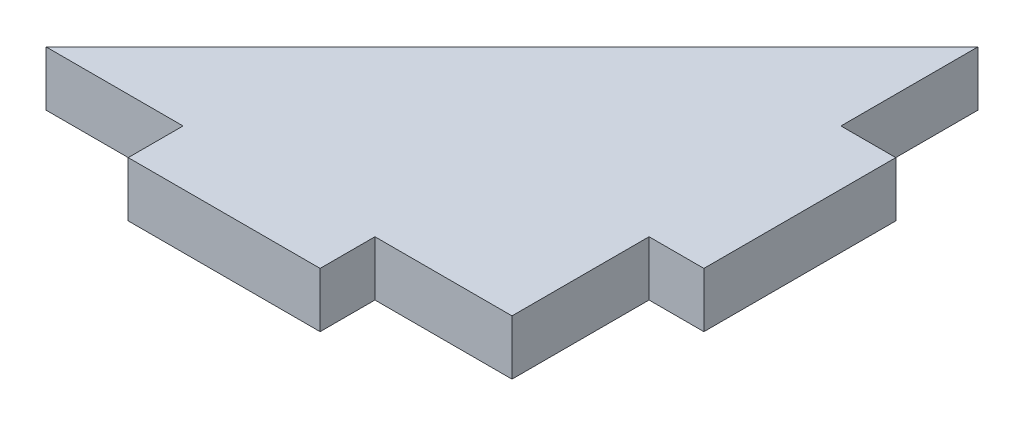
ISO-10303-21;
HEADER;
FILE_DESCRIPTION(('STEP AP214'),'2;1');
FILE_NAME('part.step','',(''),(''),'','','');
FILE_SCHEMA(('AUTOMOTIVE_DESIGN { 1 0 10303 214 1 1 1 1 }'));
ENDSEC;
DATA;
#1=APPLICATION_CONTEXT('core data for automotive mechanical design processes');
#2=APPLICATION_PROTOCOL_DEFINITION('international standard','automotive_design',2000,#1);
#3=PRODUCT_CONTEXT('',#1,'mechanical');
#4=PRODUCT('Part','Part','',(#3));
#5=PRODUCT_RELATED_PRODUCT_CATEGORY('part','',(#4));
#6=PRODUCT_DEFINITION_FORMATION('','',#4);
#7=PRODUCT_DEFINITION_CONTEXT('part definition',#1,'design');
#8=PRODUCT_DEFINITION('design','',#6,#7);
#9=PRODUCT_DEFINITION_SHAPE('','',#8);
#10=(LENGTH_UNIT() NAMED_UNIT(*) SI_UNIT(.MILLI.,.METRE.));
#11=(NAMED_UNIT(*) PLANE_ANGLE_UNIT() SI_UNIT($,.RADIAN.));
#12=(NAMED_UNIT(*) SI_UNIT($,.STERADIAN.) SOLID_ANGLE_UNIT());
#13=UNCERTAINTY_MEASURE_WITH_UNIT(LENGTH_MEASURE(1.E-05),#10,'distance_accuracy_value','');
#14=(GEOMETRIC_REPRESENTATION_CONTEXT(3) GLOBAL_UNCERTAINTY_ASSIGNED_CONTEXT((#13)) GLOBAL_UNIT_ASSIGNED_CONTEXT((#10,
#11,#12)) REPRESENTATION_CONTEXT('',''));
#15=CARTESIAN_POINT('',(0.,0.,0.));
#16=DIRECTION('',(0.,0.,1.));
#17=DIRECTION('',(1.,0.,0.));
#18=AXIS2_PLACEMENT_3D('',#15,#16,#17);
#19=CARTESIAN_POINT('',(0.,2.,0.));
#20=DIRECTION('',(1.,0.,0.));
#21=DIRECTION('',(0.,0.,-1.));
#22=AXIS2_PLACEMENT_3D('',#19,#20,#21);
#23=PLANE('',#22);
#24=DIRECTION('',(0.,0.,1.));
#25=VECTOR('',#24,1.);
#26=CARTESIAN_POINT('',(0.,0.,0.));
#27=LINE('',#26,#25);
#28=CARTESIAN_POINT('',(0.,0.,-17.));
#29=VERTEX_POINT('',#28);
#30=CARTESIAN_POINT('',(0.,0.,-12.));
#31=VERTEX_POINT('',#30);
#32=EDGE_CURVE('E147',#29,#31,#27,.T.);
#33=ORIENTED_EDGE('',*,*,#32,.F.);
#34=DIRECTION('',(0.,-1.,0.));
#35=VECTOR('',#34,1.);
#36=CARTESIAN_POINT('',(0.,2.,-17.));
#37=LINE('',#36,#35);
#38=CARTESIAN_POINT('',(0.,2.,-17.));
#39=VERTEX_POINT('',#38);
#40=EDGE_CURVE('E11',#39,#29,#37,.T.);
#41=ORIENTED_EDGE('',*,*,#40,.F.);
#42=DIRECTION('',(0.,0.,1.));
#43=VECTOR('',#42,1.);
#44=CARTESIAN_POINT('',(0.,2.,0.));
#45=LINE('',#44,#43);
#46=CARTESIAN_POINT('',(0.,2.,-12.));
#47=VERTEX_POINT('',#46);
#48=EDGE_CURVE('E171',#39,#47,#45,.T.);
#49=ORIENTED_EDGE('',*,*,#48,.T.);
#50=DIRECTION('',(0.,-1.,0.));
#51=VECTOR('',#50,1.);
#52=CARTESIAN_POINT('',(0.,2.,-12.));
#53=LINE('',#52,#51);
#54=EDGE_CURVE('E52',#47,#31,#53,.T.);
#55=ORIENTED_EDGE('',*,*,#54,.T.);
#56=EDGE_LOOP('',(#33,#41,#49,#55));
#57=FACE_BOUND('',#56,.T.);
#58=ADVANCED_FACE('F35',(#57),#23,.T.);
#59=CARTESIAN_POINT('',(-8.5,2.,-8.5));
#60=DIRECTION('',(-0.707106781186547,0.,-0.707106781186547));
#61=DIRECTION('',(-0.707106781186548,0.,0.707106781186548));
#62=AXIS2_PLACEMENT_3D('',#59,#60,#61);
#63=PLANE('',#62);
#64=DIRECTION('',(0.707106781186548,0.,-0.707106781186548));
#65=VECTOR('',#64,1.);
#66=CARTESIAN_POINT('',(-8.5,0.,-8.5));
#67=LINE('',#66,#65);
#68=CARTESIAN_POINT('',(-17.,0.,0.));
#69=VERTEX_POINT('',#68);
#70=EDGE_CURVE('E149',#69,#29,#67,.T.);
#71=ORIENTED_EDGE('',*,*,#70,.F.);
#72=DIRECTION('',(0.,-1.,0.));
#73=VECTOR('',#72,1.);
#74=CARTESIAN_POINT('',(-17.,2.,0.));
#75=LINE('',#74,#73);
#76=CARTESIAN_POINT('',(-17.,2.,0.));
#77=VERTEX_POINT('',#76);
#78=EDGE_CURVE('E44',#77,#69,#75,.T.);
#79=ORIENTED_EDGE('',*,*,#78,.F.);
#80=DIRECTION('',(0.707106781186548,0.,-0.707106781186548));
#81=VECTOR('',#80,1.);
#82=CARTESIAN_POINT('',(-8.5,2.,-8.5));
#83=LINE('',#82,#81);
#84=EDGE_CURVE('E217',#77,#39,#83,.T.);
#85=ORIENTED_EDGE('',*,*,#84,.T.);
#86=ORIENTED_EDGE('',*,*,#40,.T.);
#87=EDGE_LOOP('',(#71,#79,#85,#86));
#88=FACE_BOUND('',#87,.T.);
#89=ADVANCED_FACE('F37',(#88),#63,.T.);
#90=CARTESIAN_POINT('',(0.,2.,0.));
#91=DIRECTION('',(0.,0.,1.));
#92=DIRECTION('',(1.,0.,0.));
#93=AXIS2_PLACEMENT_3D('',#90,#91,#92);
#94=PLANE('',#93);
#95=DIRECTION('',(-1.,0.,0.));
#96=VECTOR('',#95,1.);
#97=CARTESIAN_POINT('',(0.,0.,0.));
#98=LINE('',#97,#96);
#99=CARTESIAN_POINT('',(-12.,0.,0.));
#100=VERTEX_POINT('',#99);
#101=EDGE_CURVE('E153',#100,#69,#98,.T.);
#102=ORIENTED_EDGE('',*,*,#101,.F.);
#103=DIRECTION('',(0.,-1.,0.));
#104=VECTOR('',#103,1.);
#105=CARTESIAN_POINT('',(-12.,2.,0.));
#106=LINE('',#105,#104);
#107=CARTESIAN_POINT('',(-12.,2.,0.));
#108=VERTEX_POINT('',#107);
#109=EDGE_CURVE('E184',#108,#100,#106,.T.);
#110=ORIENTED_EDGE('',*,*,#109,.F.);
#111=DIRECTION('',(-1.,0.,0.));
#112=VECTOR('',#111,1.);
#113=CARTESIAN_POINT('',(0.,2.,0.));
#114=LINE('',#113,#112);
#115=EDGE_CURVE('E191',#108,#77,#114,.T.);
#116=ORIENTED_EDGE('',*,*,#115,.T.);
#117=ORIENTED_EDGE('',*,*,#78,.T.);
#118=EDGE_LOOP('',(#102,#110,#116,#117));
#119=FACE_BOUND('',#118,.T.);
#120=ADVANCED_FACE('F189',(#119),#94,.T.);
#121=CARTESIAN_POINT('',(-12.,2.,0.));
#122=DIRECTION('',(1.,0.,0.));
#123=DIRECTION('',(0.,0.,-1.));
#124=AXIS2_PLACEMENT_3D('',#121,#122,#123);
#125=PLANE('',#124);
#126=DIRECTION('',(0.,0.,1.));
#127=VECTOR('',#126,1.);
#128=CARTESIAN_POINT('',(-12.,0.,0.));
#129=LINE('',#128,#127);
#130=CARTESIAN_POINT('',(-12.,0.,2.));
#131=VERTEX_POINT('',#130);
#132=EDGE_CURVE('E156',#100,#131,#129,.T.);
#133=ORIENTED_EDGE('',*,*,#132,.T.);
#134=DIRECTION('',(0.,-1.,0.));
#135=VECTOR('',#134,1.);
#136=CARTESIAN_POINT('',(-12.,2.,2.));
#137=LINE('',#136,#135);
#138=CARTESIAN_POINT('',(-12.,2.,2.));
#139=VERTEX_POINT('',#138);
#140=EDGE_CURVE('E181',#139,#131,#137,.T.);
#141=ORIENTED_EDGE('',*,*,#140,.F.);
#142=DIRECTION('',(0.,0.,1.));
#143=VECTOR('',#142,1.);
#144=CARTESIAN_POINT('',(-12.,2.,0.));
#145=LINE('',#144,#143);
#146=EDGE_CURVE('E211',#108,#139,#145,.T.);
#147=ORIENTED_EDGE('',*,*,#146,.F.);
#148=ORIENTED_EDGE('',*,*,#109,.T.);
#149=EDGE_LOOP('',(#133,#141,#147,#148));
#150=FACE_BOUND('',#149,.T.);
#151=ADVANCED_FACE('F201',(#150),#125,.F.);
#152=CARTESIAN_POINT('',(0.,2.,2.));
#153=DIRECTION('',(0.,0.,-1.));
#154=DIRECTION('',(-1.,0.,0.));
#155=AXIS2_PLACEMENT_3D('',#152,#153,#154);
#156=PLANE('',#155);
#157=DIRECTION('',(1.,0.,0.));
#158=VECTOR('',#157,1.);
#159=CARTESIAN_POINT('',(0.,0.,2.));
#160=LINE('',#159,#158);
#161=CARTESIAN_POINT('',(-5.,0.,2.));
#162=VERTEX_POINT('',#161);
#163=EDGE_CURVE('E159',#131,#162,#160,.T.);
#164=ORIENTED_EDGE('',*,*,#163,.T.);
#165=DIRECTION('',(0.,-1.,0.));
#166=VECTOR('',#165,1.);
#167=CARTESIAN_POINT('',(-5.,2.,2.));
#168=LINE('',#167,#166);
#169=CARTESIAN_POINT('',(-5.,2.,2.));
#170=VERTEX_POINT('',#169);
#171=EDGE_CURVE('E179',#170,#162,#168,.T.);
#172=ORIENTED_EDGE('',*,*,#171,.F.);
#173=DIRECTION('',(1.,0.,0.));
#174=VECTOR('',#173,1.);
#175=CARTESIAN_POINT('',(0.,2.,2.));
#176=LINE('',#175,#174);
#177=EDGE_CURVE('E207',#139,#170,#176,.T.);
#178=ORIENTED_EDGE('',*,*,#177,.F.);
#179=ORIENTED_EDGE('',*,*,#140,.T.);
#180=EDGE_LOOP('',(#164,#172,#178,#179));
#181=FACE_BOUND('',#180,.T.);
#182=ADVANCED_FACE('F205',(#181),#156,.F.);
#183=CARTESIAN_POINT('',(-5.,2.,0.));
#184=DIRECTION('',(1.,0.,0.));
#185=DIRECTION('',(0.,0.,-1.));
#186=AXIS2_PLACEMENT_3D('',#183,#184,#185);
#187=PLANE('',#186);
#188=DIRECTION('',(0.,0.,1.));
#189=VECTOR('',#188,1.);
#190=CARTESIAN_POINT('',(-5.,0.,0.));
#191=LINE('',#190,#189);
#192=CARTESIAN_POINT('',(-5.,0.,0.));
#193=VERTEX_POINT('',#192);
#194=EDGE_CURVE('E162',#193,#162,#191,.T.);
#195=ORIENTED_EDGE('',*,*,#194,.F.);
#196=DIRECTION('',(0.,-1.,0.));
#197=VECTOR('',#196,1.);
#198=CARTESIAN_POINT('',(-5.,2.,0.));
#199=LINE('',#198,#197);
#200=CARTESIAN_POINT('',(-5.,2.,0.));
#201=VERTEX_POINT('',#200);
#202=EDGE_CURVE('E177',#201,#193,#199,.T.);
#203=ORIENTED_EDGE('',*,*,#202,.F.);
#204=DIRECTION('',(0.,0.,1.));
#205=VECTOR('',#204,1.);
#206=CARTESIAN_POINT('',(-5.,2.,0.));
#207=LINE('',#206,#205);
#208=EDGE_CURVE('E210',#201,#170,#207,.T.);
#209=ORIENTED_EDGE('',*,*,#208,.T.);
#210=ORIENTED_EDGE('',*,*,#171,.T.);
#211=EDGE_LOOP('',(#195,#203,#209,#210));
#212=FACE_BOUND('',#211,.T.);
#213=ADVANCED_FACE('F226',(#212),#187,.T.);
#214=CARTESIAN_POINT('',(0.,0.,0.));
#215=VERTEX_POINT('',#214);
#216=EDGE_CURVE('E157',#215,#193,#98,.T.);
#217=ORIENTED_EDGE('',*,*,#216,.F.);
#218=DIRECTION('',(0.,-1.,0.));
#219=VECTOR('',#218,1.);
#220=CARTESIAN_POINT('',(0.,2.,0.));
#221=LINE('',#220,#219);
#222=CARTESIAN_POINT('',(0.,2.,0.));
#223=VERTEX_POINT('',#222);
#224=EDGE_CURVE('E175',#223,#215,#221,.T.);
#225=ORIENTED_EDGE('',*,*,#224,.F.);
#226=EDGE_CURVE('E213',#223,#201,#114,.T.);
#227=ORIENTED_EDGE('',*,*,#226,.T.);
#228=ORIENTED_EDGE('',*,*,#202,.T.);
#229=EDGE_LOOP('',(#217,#225,#227,#228));
#230=FACE_BOUND('',#229,.T.);
#231=ADVANCED_FACE('F223',(#230),#94,.T.);
#232=CARTESIAN_POINT('',(0.,0.,-5.));
#233=VERTEX_POINT('',#232);
#234=EDGE_CURVE('E150',#233,#215,#27,.T.);
#235=ORIENTED_EDGE('',*,*,#234,.F.);
#236=DIRECTION('',(0.,-1.,0.));
#237=VECTOR('',#236,1.);
#238=CARTESIAN_POINT('',(0.,2.,-5.));
#239=LINE('',#238,#237);
#240=CARTESIAN_POINT('',(0.,2.,-5.));
#241=VERTEX_POINT('',#240);
#242=EDGE_CURVE('E139',#241,#233,#239,.T.);
#243=ORIENTED_EDGE('',*,*,#242,.F.);
#244=EDGE_CURVE('E129',#241,#223,#45,.T.);
#245=ORIENTED_EDGE('',*,*,#244,.T.);
#246=ORIENTED_EDGE('',*,*,#224,.T.);
#247=EDGE_LOOP('',(#235,#243,#245,#246));
#248=FACE_BOUND('',#247,.T.);
#249=ADVANCED_FACE('F230',(#248),#23,.T.);
#250=CARTESIAN_POINT('',(0.,2.,-5.));
#251=DIRECTION('',(0.,0.,-1.));
#252=DIRECTION('',(-1.,0.,0.));
#253=AXIS2_PLACEMENT_3D('',#250,#251,#252);
#254=PLANE('',#253);
#255=DIRECTION('',(1.,0.,0.));
#256=VECTOR('',#255,1.);
#257=CARTESIAN_POINT('',(0.,0.,-5.));
#258=LINE('',#257,#256);
#259=CARTESIAN_POINT('',(2.,0.,-5.));
#260=VERTEX_POINT('',#259);
#261=EDGE_CURVE('E136',#233,#260,#258,.T.);
#262=ORIENTED_EDGE('',*,*,#261,.T.);
#263=DIRECTION('',(0.,-1.,0.));
#264=VECTOR('',#263,1.);
#265=CARTESIAN_POINT('',(2.,2.,-5.));
#266=LINE('',#265,#264);
#267=CARTESIAN_POINT('',(2.,2.,-5.));
#268=VERTEX_POINT('',#267);
#269=EDGE_CURVE('E133',#268,#260,#266,.T.);
#270=ORIENTED_EDGE('',*,*,#269,.F.);
#271=DIRECTION('',(1.,0.,0.));
#272=VECTOR('',#271,1.);
#273=CARTESIAN_POINT('',(0.,2.,-5.));
#274=LINE('',#273,#272);
#275=EDGE_CURVE('E121',#241,#268,#274,.T.);
#276=ORIENTED_EDGE('',*,*,#275,.F.);
#277=ORIENTED_EDGE('',*,*,#242,.T.);
#278=EDGE_LOOP('',(#262,#270,#276,#277));
#279=FACE_BOUND('',#278,.T.);
#280=ADVANCED_FACE('F134',(#279),#254,.F.);
#281=CARTESIAN_POINT('',(2.,2.,0.));
#282=DIRECTION('',(-1.,0.,0.));
#283=DIRECTION('',(0.,0.,1.));
#284=AXIS2_PLACEMENT_3D('',#281,#282,#283);
#285=PLANE('',#284);
#286=DIRECTION('',(0.,0.,-1.));
#287=VECTOR('',#286,1.);
#288=CARTESIAN_POINT('',(2.,0.,0.));
#289=LINE('',#288,#287);
#290=CARTESIAN_POINT('',(2.,0.,-12.));
#291=VERTEX_POINT('',#290);
#292=EDGE_CURVE('E166',#260,#291,#289,.T.);
#293=ORIENTED_EDGE('',*,*,#292,.T.);
#294=DIRECTION('',(0.,-1.,0.));
#295=VECTOR('',#294,1.);
#296=CARTESIAN_POINT('',(2.,2.,-12.));
#297=LINE('',#296,#295);
#298=CARTESIAN_POINT('',(2.,2.,-12.));
#299=VERTEX_POINT('',#298);
#300=EDGE_CURVE('E87',#299,#291,#297,.T.);
#301=ORIENTED_EDGE('',*,*,#300,.F.);
#302=DIRECTION('',(0.,0.,-1.));
#303=VECTOR('',#302,1.);
#304=CARTESIAN_POINT('',(2.,2.,0.));
#305=LINE('',#304,#303);
#306=EDGE_CURVE('E126',#268,#299,#305,.T.);
#307=ORIENTED_EDGE('',*,*,#306,.F.);
#308=ORIENTED_EDGE('',*,*,#269,.T.);
#309=EDGE_LOOP('',(#293,#301,#307,#308));
#310=FACE_BOUND('',#309,.T.);
#311=ADVANCED_FACE('F141',(#310),#285,.F.);
#312=CARTESIAN_POINT('',(0.,2.,-12.));
#313=DIRECTION('',(0.,0.,-1.));
#314=DIRECTION('',(-1.,0.,0.));
#315=AXIS2_PLACEMENT_3D('',#312,#313,#314);
#316=PLANE('',#315);
#317=DIRECTION('',(1.,0.,0.));
#318=VECTOR('',#317,1.);
#319=CARTESIAN_POINT('',(0.,0.,-12.));
#320=LINE('',#319,#318);
#321=EDGE_CURVE('E168',#31,#291,#320,.T.);
#322=ORIENTED_EDGE('',*,*,#321,.F.);
#323=ORIENTED_EDGE('',*,*,#54,.F.);
#324=DIRECTION('',(1.,0.,0.));
#325=VECTOR('',#324,1.);
#326=CARTESIAN_POINT('',(0.,2.,-12.));
#327=LINE('',#326,#325);
#328=EDGE_CURVE('E142',#47,#299,#327,.T.);
#329=ORIENTED_EDGE('',*,*,#328,.T.);
#330=ORIENTED_EDGE('',*,*,#300,.T.);
#331=EDGE_LOOP('',(#322,#323,#329,#330));
#332=FACE_BOUND('',#331,.T.);
#333=ADVANCED_FACE('F243',(#332),#316,.T.);
#334=CARTESIAN_POINT('',(0.,2.,0.));
#335=DIRECTION('',(0.,1.,0.));
#336=DIRECTION('',(0.,0.,1.));
#337=AXIS2_PLACEMENT_3D('',#334,#335,#336);
#338=PLANE('',#337);
#339=ORIENTED_EDGE('',*,*,#48,.F.);
#340=ORIENTED_EDGE('',*,*,#84,.F.);
#341=ORIENTED_EDGE('',*,*,#115,.F.);
#342=ORIENTED_EDGE('',*,*,#146,.T.);
#343=ORIENTED_EDGE('',*,*,#177,.T.);
#344=ORIENTED_EDGE('',*,*,#208,.F.);
#345=ORIENTED_EDGE('',*,*,#226,.F.);
#346=ORIENTED_EDGE('',*,*,#244,.F.);
#347=ORIENTED_EDGE('',*,*,#275,.T.);
#348=ORIENTED_EDGE('',*,*,#306,.T.);
#349=ORIENTED_EDGE('',*,*,#328,.F.);
#350=EDGE_LOOP('',(#339,#340,#341,#342,#343,#344,#345,#346,#347,#348,#349));
#351=FACE_BOUND('',#350,.T.);
#352=ADVANCED_FACE('F123',(#351),#338,.T.);
#353=CARTESIAN_POINT('',(0.,0.,0.));
#354=DIRECTION('',(0.,1.,0.));
#355=DIRECTION('',(0.,0.,1.));
#356=AXIS2_PLACEMENT_3D('',#353,#354,#355);
#357=PLANE('',#356);
#358=ORIENTED_EDGE('',*,*,#32,.T.);
#359=ORIENTED_EDGE('',*,*,#321,.T.);
#360=ORIENTED_EDGE('',*,*,#292,.F.);
#361=ORIENTED_EDGE('',*,*,#261,.F.);
#362=ORIENTED_EDGE('',*,*,#234,.T.);
#363=ORIENTED_EDGE('',*,*,#216,.T.);
#364=ORIENTED_EDGE('',*,*,#194,.T.);
#365=ORIENTED_EDGE('',*,*,#163,.F.);
#366=ORIENTED_EDGE('',*,*,#132,.F.);
#367=ORIENTED_EDGE('',*,*,#101,.T.);
#368=ORIENTED_EDGE('',*,*,#70,.T.);
#369=EDGE_LOOP('',(#358,#359,#360,#361,#362,#363,#364,#365,#366,#367,#368));
#370=FACE_BOUND('',#369,.T.);
#371=ADVANCED_FACE('F197',(#370),#357,.F.);
#372=CLOSED_SHELL('',(#58,#89,#120,#151,#182,#213,#231,#249,#280,#311,#333,#352,#371));
#373=MANIFOLD_SOLID_BREP('B2',#372);
#374=ADVANCED_BREP_SHAPE_REPRESENTATION('',(#18,#373),#14);
#375=SHAPE_DEFINITION_REPRESENTATION(#9,#374);
ENDSEC;
END-ISO-10303-21;
